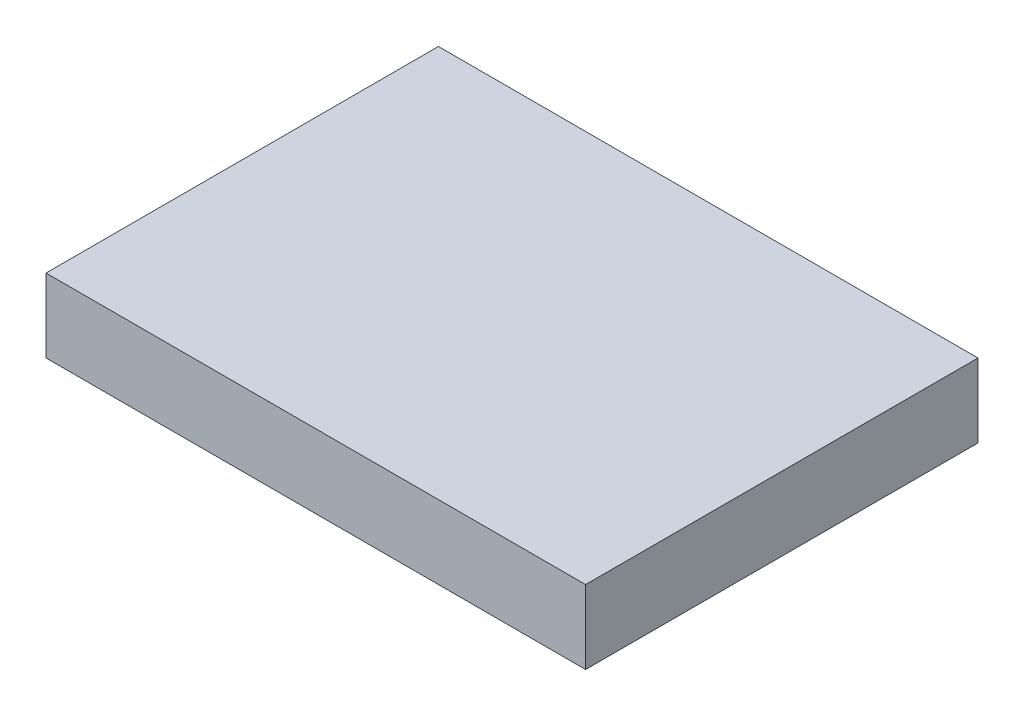
ISO-10303-21;
HEADER;
FILE_DESCRIPTION(('STEP AP214'),'2;1');
FILE_NAME('part.step','',(''),(''),'','','');
FILE_SCHEMA(('AUTOMOTIVE_DESIGN { 1 0 10303 214 1 1 1 1 }'));
ENDSEC;
DATA;
#1=APPLICATION_CONTEXT('core data for automotive mechanical design processes');
#2=APPLICATION_PROTOCOL_DEFINITION('international standard','automotive_design',2000,#1);
#3=PRODUCT_CONTEXT('',#1,'mechanical');
#4=PRODUCT('Part','Part','',(#3));
#5=PRODUCT_RELATED_PRODUCT_CATEGORY('part','',(#4));
#6=PRODUCT_DEFINITION_FORMATION('','',#4);
#7=PRODUCT_DEFINITION_CONTEXT('part definition',#1,'design');
#8=PRODUCT_DEFINITION('design','',#6,#7);
#9=PRODUCT_DEFINITION_SHAPE('','',#8);
#10=(LENGTH_UNIT() NAMED_UNIT(*) SI_UNIT(.MILLI.,.METRE.));
#11=(NAMED_UNIT(*) PLANE_ANGLE_UNIT() SI_UNIT($,.RADIAN.));
#12=(NAMED_UNIT(*) SI_UNIT($,.STERADIAN.) SOLID_ANGLE_UNIT());
#13=UNCERTAINTY_MEASURE_WITH_UNIT(LENGTH_MEASURE(1.E-05),#10,'distance_accuracy_value','');
#14=(GEOMETRIC_REPRESENTATION_CONTEXT(3) GLOBAL_UNCERTAINTY_ASSIGNED_CONTEXT((#13)) GLOBAL_UNIT_ASSIGNED_CONTEXT((#10,
#11,#12)) REPRESENTATION_CONTEXT('',''));
#15=CARTESIAN_POINT('',(0.,0.,0.));
#16=DIRECTION('',(0.,0.,1.));
#17=DIRECTION('',(1.,0.,0.));
#18=AXIS2_PLACEMENT_3D('',#15,#16,#17);
#19=CARTESIAN_POINT('',(0.,9.525,0.));
#20=DIRECTION('',(1.,0.,0.));
#21=DIRECTION('',(0.,0.,-1.));
#22=AXIS2_PLACEMENT_3D('',#19,#20,#21);
#23=PLANE('',#22);
#24=DIRECTION('',(0.,0.,1.));
#25=VECTOR('',#24,1.);
#26=CARTESIAN_POINT('',(0.,0.,0.));
#27=LINE('',#26,#25);
#28=CARTESIAN_POINT('',(0.,0.,-50.8));
#29=VERTEX_POINT('',#28);
#30=CARTESIAN_POINT('',(0.,0.,0.));
#31=VERTEX_POINT('',#30);
#32=EDGE_CURVE('E98',#29,#31,#27,.T.);
#33=ORIENTED_EDGE('',*,*,#32,.T.);
#34=DIRECTION('',(0.,-1.,0.));
#35=VECTOR('',#34,1.);
#36=CARTESIAN_POINT('',(0.,9.525,0.));
#37=LINE('',#36,#35);
#38=CARTESIAN_POINT('',(0.,9.525,0.));
#39=VERTEX_POINT('',#38);
#40=EDGE_CURVE('E11',#39,#31,#37,.T.);
#41=ORIENTED_EDGE('',*,*,#40,.F.);
#42=DIRECTION('',(0.,0.,1.));
#43=VECTOR('',#42,1.);
#44=CARTESIAN_POINT('',(0.,9.525,0.));
#45=LINE('',#44,#43);
#46=CARTESIAN_POINT('',(0.,9.525,-50.8));
#47=VERTEX_POINT('',#46);
#48=EDGE_CURVE('E86',#47,#39,#45,.T.);
#49=ORIENTED_EDGE('',*,*,#48,.F.);
#50=DIRECTION('',(0.,-1.,0.));
#51=VECTOR('',#50,1.);
#52=CARTESIAN_POINT('',(0.,9.525,-50.8));
#53=LINE('',#52,#51);
#54=EDGE_CURVE('E94',#47,#29,#53,.T.);
#55=ORIENTED_EDGE('',*,*,#54,.T.);
#56=EDGE_LOOP('',(#33,#41,#49,#55));
#57=FACE_BOUND('',#56,.T.);
#58=ADVANCED_FACE('F35',(#57),#23,.F.);
#59=CARTESIAN_POINT('',(0.,9.525,0.));
#60=DIRECTION('',(0.,0.,-1.));
#61=DIRECTION('',(-1.,0.,0.));
#62=AXIS2_PLACEMENT_3D('',#59,#60,#61);
#63=PLANE('',#62);
#64=DIRECTION('',(1.,0.,0.));
#65=VECTOR('',#64,1.);
#66=CARTESIAN_POINT('',(0.,0.,0.));
#67=LINE('',#66,#65);
#68=CARTESIAN_POINT('',(69.85,0.,0.));
#69=VERTEX_POINT('',#68);
#70=EDGE_CURVE('E90',#31,#69,#67,.T.);
#71=ORIENTED_EDGE('',*,*,#70,.T.);
#72=DIRECTION('',(0.,-1.,0.));
#73=VECTOR('',#72,1.);
#74=CARTESIAN_POINT('',(69.85,9.525,0.));
#75=LINE('',#74,#73);
#76=CARTESIAN_POINT('',(69.85,9.525,0.));
#77=VERTEX_POINT('',#76);
#78=EDGE_CURVE('E43',#77,#69,#75,.T.);
#79=ORIENTED_EDGE('',*,*,#78,.F.);
#80=DIRECTION('',(1.,0.,0.));
#81=VECTOR('',#80,1.);
#82=CARTESIAN_POINT('',(0.,9.525,0.));
#83=LINE('',#82,#81);
#84=EDGE_CURVE('E81',#39,#77,#83,.T.);
#85=ORIENTED_EDGE('',*,*,#84,.F.);
#86=ORIENTED_EDGE('',*,*,#40,.T.);
#87=EDGE_LOOP('',(#71,#79,#85,#86));
#88=FACE_BOUND('',#87,.T.);
#89=ADVANCED_FACE('F89',(#88),#63,.F.);
#90=CARTESIAN_POINT('',(69.85,9.525,0.));
#91=DIRECTION('',(-1.,0.,0.));
#92=DIRECTION('',(0.,0.,1.));
#93=AXIS2_PLACEMENT_3D('',#90,#91,#92);
#94=PLANE('',#93);
#95=DIRECTION('',(0.,0.,-1.));
#96=VECTOR('',#95,1.);
#97=CARTESIAN_POINT('',(69.85,0.,0.));
#98=LINE('',#97,#96);
#99=CARTESIAN_POINT('',(69.85,0.,-50.8));
#100=VERTEX_POINT('',#99);
#101=EDGE_CURVE('E68',#69,#100,#98,.T.);
#102=ORIENTED_EDGE('',*,*,#101,.T.);
#103=DIRECTION('',(0.,-1.,0.));
#104=VECTOR('',#103,1.);
#105=CARTESIAN_POINT('',(69.85,9.525,-50.8));
#106=LINE('',#105,#104);
#107=CARTESIAN_POINT('',(69.85,9.525,-50.8));
#108=VERTEX_POINT('',#107);
#109=EDGE_CURVE('E91',#108,#100,#106,.T.);
#110=ORIENTED_EDGE('',*,*,#109,.F.);
#111=DIRECTION('',(0.,0.,-1.));
#112=VECTOR('',#111,1.);
#113=CARTESIAN_POINT('',(69.85,9.525,0.));
#114=LINE('',#113,#112);
#115=EDGE_CURVE('E84',#77,#108,#114,.T.);
#116=ORIENTED_EDGE('',*,*,#115,.F.);
#117=ORIENTED_EDGE('',*,*,#78,.T.);
#118=EDGE_LOOP('',(#102,#110,#116,#117));
#119=FACE_BOUND('',#118,.T.);
#120=ADVANCED_FACE('F92',(#119),#94,.F.);
#121=CARTESIAN_POINT('',(0.,9.525,-50.8));
#122=DIRECTION('',(0.,0.,1.));
#123=DIRECTION('',(1.,0.,0.));
#124=AXIS2_PLACEMENT_3D('',#121,#122,#123);
#125=PLANE('',#124);
#126=DIRECTION('',(-1.,0.,0.));
#127=VECTOR('',#126,1.);
#128=CARTESIAN_POINT('',(0.,0.,-50.8));
#129=LINE('',#128,#127);
#130=EDGE_CURVE('E74',#100,#29,#129,.T.);
#131=ORIENTED_EDGE('',*,*,#130,.T.);
#132=ORIENTED_EDGE('',*,*,#54,.F.);
#133=DIRECTION('',(-1.,0.,0.));
#134=VECTOR('',#133,1.);
#135=CARTESIAN_POINT('',(0.,9.525,-50.8));
#136=LINE('',#135,#134);
#137=EDGE_CURVE('E51',#108,#47,#136,.T.);
#138=ORIENTED_EDGE('',*,*,#137,.F.);
#139=ORIENTED_EDGE('',*,*,#109,.T.);
#140=EDGE_LOOP('',(#131,#132,#138,#139));
#141=FACE_BOUND('',#140,.T.);
#142=ADVANCED_FACE('F105',(#141),#125,.F.);
#143=CARTESIAN_POINT('',(0.,9.525,0.));
#144=DIRECTION('',(0.,-1.,0.));
#145=DIRECTION('',(0.,0.,-1.));
#146=AXIS2_PLACEMENT_3D('',#143,#144,#145);
#147=PLANE('',#146);
#148=ORIENTED_EDGE('',*,*,#48,.T.);
#149=ORIENTED_EDGE('',*,*,#84,.T.);
#150=ORIENTED_EDGE('',*,*,#115,.T.);
#151=ORIENTED_EDGE('',*,*,#137,.T.);
#152=EDGE_LOOP('',(#148,#149,#150,#151));
#153=FACE_BOUND('',#152,.T.);
#154=ADVANCED_FACE('F82',(#153),#147,.F.);
#155=CARTESIAN_POINT('',(0.,0.,0.));
#156=DIRECTION('',(0.,-1.,0.));
#157=DIRECTION('',(0.,0.,-1.));
#158=AXIS2_PLACEMENT_3D('',#155,#156,#157);
#159=PLANE('',#158);
#160=ORIENTED_EDGE('',*,*,#32,.F.);
#161=ORIENTED_EDGE('',*,*,#130,.F.);
#162=ORIENTED_EDGE('',*,*,#101,.F.);
#163=ORIENTED_EDGE('',*,*,#70,.F.);
#164=EDGE_LOOP('',(#160,#161,#162,#163));
#165=FACE_BOUND('',#164,.T.);
#166=ADVANCED_FACE('F108',(#165),#159,.T.);
#167=CLOSED_SHELL('',(#58,#89,#120,#142,#154,#166));
#168=MANIFOLD_SOLID_BREP('B2',#167);
#169=ADVANCED_BREP_SHAPE_REPRESENTATION('',(#18,#168),#14);
#170=SHAPE_DEFINITION_REPRESENTATION(#9,#169);
ENDSEC;
END-ISO-10303-21;
